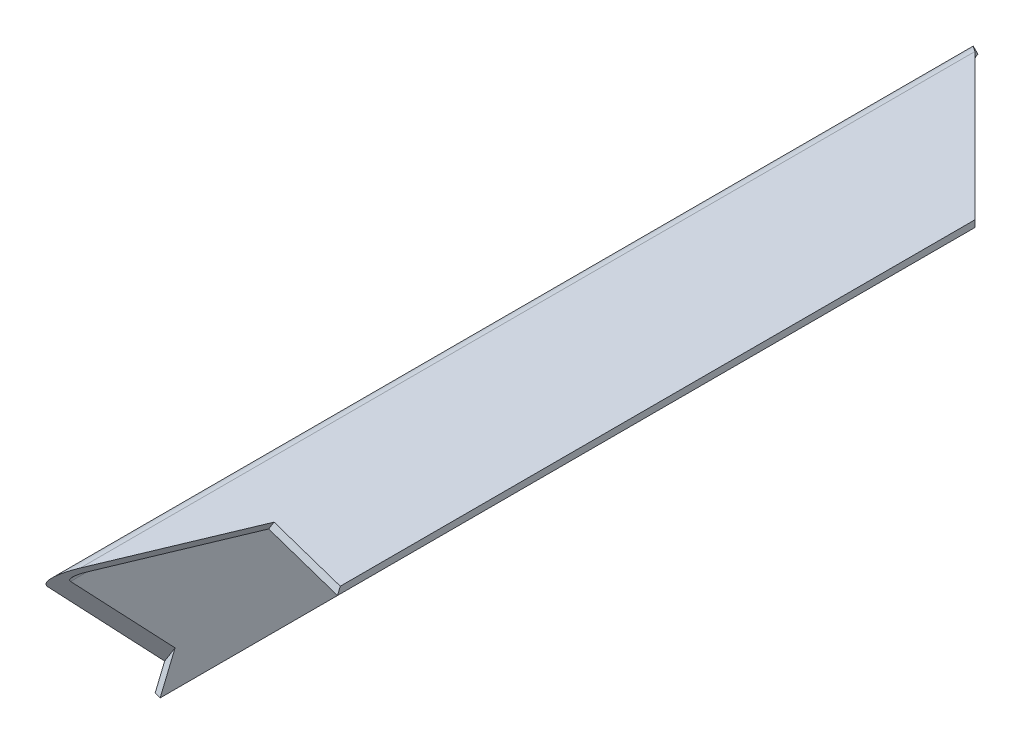
ISO-10303-21;
HEADER;
FILE_DESCRIPTION(('STEP AP214'),'2;1');
FILE_NAME('part.step','',(''),(''),'','','');
FILE_SCHEMA(('AUTOMOTIVE_DESIGN { 1 0 10303 214 1 1 1 1 }'));
ENDSEC;
DATA;
#1=APPLICATION_CONTEXT('core data for automotive mechanical design processes');
#2=APPLICATION_PROTOCOL_DEFINITION('international standard','automotive_design',2000,#1);
#3=PRODUCT_CONTEXT('',#1,'mechanical');
#4=PRODUCT('Part','Part','',(#3));
#5=PRODUCT_RELATED_PRODUCT_CATEGORY('part','',(#4));
#6=PRODUCT_DEFINITION_FORMATION('','',#4);
#7=PRODUCT_DEFINITION_CONTEXT('part definition',#1,'design');
#8=PRODUCT_DEFINITION('design','',#6,#7);
#9=PRODUCT_DEFINITION_SHAPE('','',#8);
#10=(LENGTH_UNIT() NAMED_UNIT(*) SI_UNIT(.MILLI.,.METRE.));
#11=(NAMED_UNIT(*) PLANE_ANGLE_UNIT() SI_UNIT($,.RADIAN.));
#12=(NAMED_UNIT(*) SI_UNIT($,.STERADIAN.) SOLID_ANGLE_UNIT());
#13=UNCERTAINTY_MEASURE_WITH_UNIT(LENGTH_MEASURE(1.E-05),#10,'distance_accuracy_value','');
#14=(GEOMETRIC_REPRESENTATION_CONTEXT(3) GLOBAL_UNCERTAINTY_ASSIGNED_CONTEXT((#13)) GLOBAL_UNIT_ASSIGNED_CONTEXT((#10,
#11,#12)) REPRESENTATION_CONTEXT('',''));
#15=CARTESIAN_POINT('',(0.,0.,0.));
#16=DIRECTION('',(0.,0.,1.));
#17=DIRECTION('',(1.,0.,0.));
#18=AXIS2_PLACEMENT_3D('',#15,#16,#17);
#19=CARTESIAN_POINT('',(-112.900713999999,0.188336430717542,0.));
#20=DIRECTION('',(-1.,0.,0.));
#21=DIRECTION('',(0.,0.,1.));
#22=AXIS2_PLACEMENT_3D('',#19,#20,#21);
#23=PLANE('',#22);
#24=DIRECTION('',(0.,-0.724219985563204,-0.68956900489424));
#25=VECTOR('',#24,1.);
#26=CARTESIAN_POINT('',(-112.900714,58.5682559872829,-61.3135222122132));
#27=LINE('',#26,#25);
#28=CARTESIAN_POINT('',(-112.900714,111.427514,-10.983364699464));
#29=VERTEX_POINT('',#28);
#30=CARTESIAN_POINT('',(-112.900714,97.9549512400546,-23.8113201286776));
#31=VERTEX_POINT('',#30);
#32=EDGE_CURVE('E114',#29,#31,#27,.T.);
#33=ORIENTED_EDGE('',*,*,#32,.F.);
#34=DIRECTION('',(0.,0.,-1.));
#35=VECTOR('',#34,1.);
#36=CARTESIAN_POINT('',(-112.900714,111.427514,0.));
#37=LINE('',#36,#35);
#38=CARTESIAN_POINT('',(-112.900714,111.427514,-111.239177569261));
#39=VERTEX_POINT('',#38);
#40=EDGE_CURVE('E54',#29,#39,#37,.T.);
#41=ORIENTED_EDGE('',*,*,#40,.T.);
#42=DIRECTION('',(0.,0.707106781186616,-0.70710678118648));
#43=VECTOR('',#42,1.);
#44=CARTESIAN_POINT('',(-112.900714,112.295300430737,-112.106963999998));
#45=LINE('',#44,#43);
#46=CARTESIAN_POINT('',(-112.900714,95.4360504307374,-95.2477140000015));
#47=VERTEX_POINT('',#46);
#48=EDGE_CURVE('E295',#47,#39,#45,.T.);
#49=ORIENTED_EDGE('',*,*,#48,.F.);
#50=DIRECTION('',(0.,0.,-1.));
#51=VECTOR('',#50,1.);
#52=CARTESIAN_POINT('',(-112.900714,95.4360504307374,95.2477140000016));
#53=LINE('',#52,#51);
#54=CARTESIAN_POINT('',(-112.900714,95.4360504307374,-22.762837404634));
#55=VERTEX_POINT('',#54);
#56=EDGE_CURVE('E131',#55,#47,#53,.T.);
#57=ORIENTED_EDGE('',*,*,#56,.F.);
#58=DIRECTION('',(0.,-0.923214701144146,0.384284550289659));
#59=VECTOR('',#58,1.);
#60=CARTESIAN_POINT('',(-112.900713999999,6.1782714866546,14.3903680186245));
#61=LINE('',#60,#59);
#62=EDGE_CURVE('E124',#31,#55,#61,.T.);
#63=ORIENTED_EDGE('',*,*,#62,.F.);
#64=EDGE_LOOP('',(#33,#41,#49,#57,#63));
#65=FACE_BOUND('',#64,.T.);
#66=ADVANCED_FACE('F32',(#65),#23,.T.);
#67=CARTESIAN_POINT('',(-112.164114,95.4360504307374,95.2477140000016));
#68=DIRECTION('',(0.,1.,0.));
#69=DIRECTION('',(0.,0.,1.));
#70=AXIS2_PLACEMENT_3D('',#67,#68,#69);
#71=PLANE('',#70);
#72=DIRECTION('',(0.,0.,-1.));
#73=VECTOR('',#72,1.);
#74=CARTESIAN_POINT('',(-112.164114,95.4360504307374,95.2477140000016));
#75=LINE('',#74,#73);
#76=CARTESIAN_POINT('',(-112.164114,95.4360504307374,-22.576656283523));
#77=VERTEX_POINT('',#76);
#78=CARTESIAN_POINT('',(-112.164114,95.4360504307374,-95.2477140000015));
#79=VERTEX_POINT('',#78);
#80=EDGE_CURVE('E297',#77,#79,#75,.T.);
#81=ORIENTED_EDGE('',*,*,#80,.F.);
#82=DIRECTION('',(-0.969510212842495,0.,-0.245050907352125));
#83=VECTOR('',#82,1.);
#84=CARTESIAN_POINT('',(-84.1714758285546,95.4360504307376,-15.5013090698193));
#85=LINE('',#84,#83);
#86=EDGE_CURVE('E133',#77,#55,#85,.T.);
#87=ORIENTED_EDGE('',*,*,#86,.T.);
#88=ORIENTED_EDGE('',*,*,#56,.T.);
#89=DIRECTION('',(-1.,0.,0.));
#90=VECTOR('',#89,1.);
#91=CARTESIAN_POINT('',(-112.164114,95.4360504307374,-95.2477140000015));
#92=LINE('',#91,#90);
#93=EDGE_CURVE('E311',#79,#47,#92,.T.);
#94=ORIENTED_EDGE('',*,*,#93,.F.);
#95=EDGE_LOOP('',(#81,#87,#88,#94));
#96=FACE_BOUND('',#95,.T.);
#97=ADVANCED_FACE('F343',(#96),#71,.F.);
#98=CARTESIAN_POINT('',(-112.164114,112.295300430737,-112.106963999998));
#99=DIRECTION('',(0.,0.70710678118648,0.707106781186616));
#100=DIRECTION('',(0.,-0.707106781186616,0.70710678118648));
#101=AXIS2_PLACEMENT_3D('',#98,#99,#100);
#102=PLANE('',#101);
#103=CARTESIAN_POINT('',(-112.164114,111.427514,-111.239177569261));
#104=CARTESIAN_POINT('',(-112.900714,111.427514,-111.239177569261));
#105=B_SPLINE_CURVE_WITH_KNOTS('',1,(#103,#104),.UNSPECIFIED.,.F.,.F.,(2,2),(0.,1.),.UNSPECIFIED.);
#106=CARTESIAN_POINT('',(-112.164114,111.427514,-111.239177569261));
#107=VERTEX_POINT('',#106);
#108=EDGE_CURVE('E255',#107,#39,#105,.T.);
#109=ORIENTED_EDGE('',*,*,#108,.F.);
#110=DIRECTION('',(0.,0.707106781186616,-0.70710678118648));
#111=VECTOR('',#110,1.);
#112=CARTESIAN_POINT('',(-112.164114,112.295300430737,-112.106963999998));
#113=LINE('',#112,#111);
#114=EDGE_CURVE('E304',#79,#107,#113,.T.);
#115=ORIENTED_EDGE('',*,*,#114,.F.);
#116=ORIENTED_EDGE('',*,*,#93,.T.);
#117=ORIENTED_EDGE('',*,*,#48,.T.);
#118=EDGE_LOOP('',(#109,#115,#116,#117));
#119=FACE_BOUND('',#118,.T.);
#120=ADVANCED_FACE('F302',(#119),#102,.F.);
#121=CARTESIAN_POINT('',(-112.164113999999,0.188336430717542,0.));
#122=DIRECTION('',(-1.,0.,0.));
#123=DIRECTION('',(0.,0.,1.));
#124=AXIS2_PLACEMENT_3D('',#121,#122,#123);
#125=PLANE('',#124);
#126=DIRECTION('',(0.,0.,-1.));
#127=VECTOR('',#126,1.);
#128=CARTESIAN_POINT('',(-112.164114,111.427514,0.));
#129=LINE('',#128,#127);
#130=CARTESIAN_POINT('',(-112.164114,111.427514,-12.7426126677546));
#131=VERTEX_POINT('',#130);
#132=EDGE_CURVE('E305',#131,#107,#129,.T.);
#133=ORIENTED_EDGE('',*,*,#132,.F.);
#134=DIRECTION('',(0.,-0.724219985563204,-0.68956900489424));
#135=VECTOR('',#134,1.);
#136=CARTESIAN_POINT('',(-112.164114,59.4468238153009,-62.2362382496329));
#137=LINE('',#136,#135);
#138=CARTESIAN_POINT('',(-112.164114,99.3766326219928,-24.2169083867113));
#139=VERTEX_POINT('',#138);
#140=EDGE_CURVE('E332',#131,#139,#137,.T.);
#141=ORIENTED_EDGE('',*,*,#140,.T.);
#142=DIRECTION('',(0.,-0.923214701144146,0.384284550289659));
#143=VECTOR('',#142,1.);
#144=CARTESIAN_POINT('',(-112.164113999999,6.24432429348798,14.549054914245));
#145=LINE('',#144,#143);
#146=EDGE_CURVE('E127',#139,#77,#145,.T.);
#147=ORIENTED_EDGE('',*,*,#146,.T.);
#148=ORIENTED_EDGE('',*,*,#80,.T.);
#149=ORIENTED_EDGE('',*,*,#114,.T.);
#150=EDGE_LOOP('',(#133,#141,#147,#148,#149));
#151=FACE_BOUND('',#150,.T.);
#152=ADVANCED_FACE('F308',(#151),#125,.F.);
#153=CARTESIAN_POINT('',(-95.436050430738,112.164114,95.2477140000016));
#154=DIRECTION('',(-1.,0.,0.));
#155=DIRECTION('',(0.,0.,-1.));
#156=AXIS2_PLACEMENT_3D('',#153,#154,#155);
#157=PLANE('',#156);
#158=DIRECTION('',(0.,0.,1.));
#159=VECTOR('',#158,1.);
#160=CARTESIAN_POINT('',(-95.436050430738,112.900714,95.2477140000016));
#161=LINE('',#160,#159);
#162=CARTESIAN_POINT('',(-95.436050430738,112.900714,-95.2477140000015));
#163=VERTEX_POINT('',#162);
#164=CARTESIAN_POINT('',(-95.436050430738,112.900714,-25.6181126623219));
#165=VERTEX_POINT('',#164);
#166=EDGE_CURVE('E273',#163,#165,#161,.T.);
#167=ORIENTED_EDGE('',*,*,#166,.T.);
#168=DIRECTION('',(0.,-0.923214701144146,0.384284550289658));
#169=VECTOR('',#168,1.);
#170=CARTESIAN_POINT('',(-95.4360504307379,69.3924580594404,-7.50796932590786));
#171=LINE('',#170,#169);
#172=CARTESIAN_POINT('',(-95.436050430738,112.164114,-25.3115057599485));
#173=VERTEX_POINT('',#172);
#174=EDGE_CURVE('E337',#165,#173,#171,.T.);
#175=ORIENTED_EDGE('',*,*,#174,.T.);
#176=DIRECTION('',(0.,0.,1.));
#177=VECTOR('',#176,1.);
#178=CARTESIAN_POINT('',(-95.436050430738,112.164114,95.2477140000016));
#179=LINE('',#178,#177);
#180=CARTESIAN_POINT('',(-95.436050430738,112.164114,-95.2477140000015));
#181=VERTEX_POINT('',#180);
#182=EDGE_CURVE('E259',#181,#173,#179,.T.);
#183=ORIENTED_EDGE('',*,*,#182,.F.);
#184=DIRECTION('',(0.,1.,0.));
#185=VECTOR('',#184,1.);
#186=CARTESIAN_POINT('',(-95.436050430738,112.164114,-95.2477140000015));
#187=LINE('',#186,#185);
#188=EDGE_CURVE('E269',#181,#163,#187,.T.);
#189=ORIENTED_EDGE('',*,*,#188,.T.);
#190=EDGE_LOOP('',(#167,#175,#183,#189));
#191=FACE_BOUND('',#190,.T.);
#192=ADVANCED_FACE('F217',(#191),#157,.F.);
#193=CARTESIAN_POINT('',(-224.402264430758,112.164113999999,0.));
#194=DIRECTION('',(0.,1.,0.));
#195=DIRECTION('',(0.,0.,1.));
#196=AXIS2_PLACEMENT_3D('',#193,#194,#195);
#197=PLANE('',#196);
#198=DIRECTION('',(-0.969510212842495,0.,-0.245050907352127));
#199=VECTOR('',#198,1.);
#200=CARTESIAN_POINT('',(-210.644358818371,112.164113999999,-54.4312614169006));
#201=LINE('',#200,#199);
#202=CARTESIAN_POINT('',(-105.538678158533,112.164114,-27.865019955615));
#203=VERTEX_POINT('',#202);
#204=EDGE_CURVE('E340',#173,#203,#201,.T.);
#205=ORIENTED_EDGE('',*,*,#204,.T.);
#206=DIRECTION('',(-0.386214206739789,0.,0.922409121004533));
#207=VECTOR('',#206,1.);
#208=CARTESIAN_POINT('',(-133.19538258964,112.164114,38.1884705141635));
#209=LINE('',#208,#207);
#210=CARTESIAN_POINT('',(-111.427514,112.164114,-13.8005039500514));
#211=VERTEX_POINT('',#210);
#212=EDGE_CURVE('E330',#203,#211,#209,.T.);
#213=ORIENTED_EDGE('',*,*,#212,.T.);
#214=DIRECTION('',(0.,0.,-1.));
#215=VECTOR('',#214,1.);
#216=CARTESIAN_POINT('',(-111.427514,112.164114,0.));
#217=LINE('',#216,#215);
#218=CARTESIAN_POINT('',(-111.427514,112.164114,-111.239177569261));
#219=VERTEX_POINT('',#218);
#220=EDGE_CURVE('E272',#211,#219,#217,.T.);
#221=ORIENTED_EDGE('',*,*,#220,.T.);
#222=DIRECTION('',(0.707106781186614,0.,0.707106781186481));
#223=VECTOR('',#222,1.);
#224=CARTESIAN_POINT('',(-112.295300430738,112.164114,-112.106963999998));
#225=LINE('',#224,#223);
#226=EDGE_CURVE('E268',#219,#181,#225,.T.);
#227=ORIENTED_EDGE('',*,*,#226,.T.);
#228=ORIENTED_EDGE('',*,*,#182,.T.);
#229=EDGE_LOOP('',(#205,#213,#221,#227,#228));
#230=FACE_BOUND('',#229,.T.);
#231=ADVANCED_FACE('F357',(#230),#197,.F.);
#232=CARTESIAN_POINT('',(-112.295300430738,112.164114,-112.106963999998));
#233=DIRECTION('',(-0.707106781186481,0.,0.707106781186614));
#234=DIRECTION('',(-0.707106781186614,0.,-0.707106781186481));
#235=AXIS2_PLACEMENT_3D('',#232,#233,#234);
#236=PLANE('',#235);
#237=ORIENTED_EDGE('',*,*,#226,.F.);
#238=CARTESIAN_POINT('',(-111.427514,112.900714,-111.239177569261));
#239=CARTESIAN_POINT('',(-111.427514,112.164114,-111.239177569261));
#240=B_SPLINE_CURVE_WITH_KNOTS('',1,(#238,#239),.UNSPECIFIED.,.F.,.F.,(2,2),(0.,1.),.UNSPECIFIED.);
#241=CARTESIAN_POINT('',(-111.427514,112.900714,-111.239177569261));
#242=VERTEX_POINT('',#241);
#243=EDGE_CURVE('E267',#219,#242,#240,.F.);
#244=ORIENTED_EDGE('',*,*,#243,.T.);
#245=DIRECTION('',(0.707106781186614,0.,0.707106781186481));
#246=VECTOR('',#245,1.);
#247=CARTESIAN_POINT('',(-112.295300430738,112.900714,-112.106963999998));
#248=LINE('',#247,#246);
#249=EDGE_CURVE('E279',#242,#163,#248,.T.);
#250=ORIENTED_EDGE('',*,*,#249,.T.);
#251=ORIENTED_EDGE('',*,*,#188,.F.);
#252=EDGE_LOOP('',(#237,#244,#250,#251));
#253=FACE_BOUND('',#252,.T.);
#254=ADVANCED_FACE('F362',(#253),#236,.F.);
#255=CARTESIAN_POINT('',(-224.402264430758,112.900713999999,0.));
#256=DIRECTION('',(0.,1.,0.));
#257=DIRECTION('',(0.,0.,1.));
#258=AXIS2_PLACEMENT_3D('',#255,#256,#257);
#259=PLANE('',#258);
#260=DIRECTION('',(-0.386214206739789,0.,0.922409121004533));
#261=VECTOR('',#260,1.);
#262=CARTESIAN_POINT('',(-132.945526018766,112.900714,38.2930858688053));
#263=LINE('',#262,#261);
#264=CARTESIAN_POINT('',(-105.15703177356,112.900714,-28.0751628995004));
#265=VERTEX_POINT('',#264);
#266=CARTESIAN_POINT('',(-111.427514,112.900714,-13.0991472640576));
#267=VERTEX_POINT('',#266);
#268=EDGE_CURVE('E46',#265,#267,#263,.T.);
#269=ORIENTED_EDGE('',*,*,#268,.F.);
#270=DIRECTION('',(-0.969510212842495,0.,-0.245050907352127));
#271=VECTOR('',#270,1.);
#272=CARTESIAN_POINT('',(-210.571515347548,112.900713999999,-54.7194565909771));
#273=LINE('',#272,#271);
#274=EDGE_CURVE('E11',#165,#265,#273,.T.);
#275=ORIENTED_EDGE('',*,*,#274,.F.);
#276=ORIENTED_EDGE('',*,*,#166,.F.);
#277=ORIENTED_EDGE('',*,*,#249,.F.);
#278=DIRECTION('',(0.,0.,-1.));
#279=VECTOR('',#278,1.);
#280=CARTESIAN_POINT('',(-111.427514,112.900714,0.));
#281=LINE('',#280,#279);
#282=EDGE_CURVE('E276',#267,#242,#281,.T.);
#283=ORIENTED_EDGE('',*,*,#282,.F.);
#284=EDGE_LOOP('',(#269,#275,#276,#277,#283));
#285=FACE_BOUND('',#284,.T.);
#286=ADVANCED_FACE('F213',(#285),#259,.T.);
#287=CARTESIAN_POINT('',(-112.900714,111.427514,-111.239177569261));
#288=CARTESIAN_POINT('',(-112.900714,111.620377681075,-111.383825330067));
#289=CARTESIAN_POINT('',(-112.862370547268,111.813120983238,-111.52843971284));
#290=CARTESIAN_POINT('',(-112.714776107324,112.169445481882,-111.817701856419));
#291=CARTESIAN_POINT('',(-112.605598926777,112.332848493311,-111.962316239192));
#292=CARTESIAN_POINT('',(-112.469223710044,112.469223710044,-112.106963999998));
#293=CARTESIAN_POINT('',(-112.164114,111.427514,-111.239177569261));
#294=CARTESIAN_POINT('',(-112.164114,111.52394006357,-111.383816664616));
#295=CARTESIAN_POINT('',(-112.144942273634,111.620317491619,-111.52843971284));
#296=CARTESIAN_POINT('',(-112.071145053662,111.798479740941,-111.817701856419));
#297=CARTESIAN_POINT('',(-112.016552378456,111.880185331588,-111.962324904643));
#298=CARTESIAN_POINT('',(-111.948368855022,111.948368855022,-112.106963999998));
#299=B_SPLINE_SURFACE_WITH_KNOTS('',1,3,((#287,#288,#289,#290,#291,#292),(#293,#294,#295,#296,
#297,#298)),.UNSPECIFIED.,.F.,.F.,.F.,(2,2),(4,2,4),(0.,1.),(0.,0.5,1.),.UNSPECIFIED.);
#300=CARTESIAN_POINT('',(-112.900714,111.427514,-111.239177569261));
#301=CARTESIAN_POINT('',(-112.900714,111.620377681075,-111.383825330067));
#302=CARTESIAN_POINT('',(-112.862370547268,111.813120983238,-111.52843971284));
#303=CARTESIAN_POINT('',(-112.714776107324,112.169445481882,-111.817701856419));
#304=CARTESIAN_POINT('',(-112.605598926777,112.332848493311,-111.962316239192));
#305=CARTESIAN_POINT('',(-112.469223710044,112.469223710044,-112.106963999998));
#306=B_SPLINE_CURVE_WITH_KNOTS('',3,(#300,#301,#302,#303,#304,#305),.UNSPECIFIED.,.F.,.F.,(4,2,
4),(0.,0.5,1.),.UNSPECIFIED.);
#307=CARTESIAN_POINT('',(-112.469223945747,112.469223474341,-112.106963749998));
#308=VERTEX_POINT('',#307);
#309=EDGE_CURVE('E132',#39,#308,#306,.T.);
#310=CARTESIAN_POINT('',(-112.469223710044,112.469223710044,-112.106963999998));
#311=CARTESIAN_POINT('',(-111.948368855022,111.948368855022,-112.106963999998));
#312=B_SPLINE_CURVE_WITH_KNOTS('',1,(#310,#311),.UNSPECIFIED.,.F.,.F.,(2,2),(0.,1.),.UNSPECIFIED.);
#313=CARTESIAN_POINT('',(-111.948368855022,111.948368855022,-112.106963999998));
#314=VERTEX_POINT('',#313);
#315=EDGE_CURVE('E245',#308,#314,#312,.T.);
#316=CARTESIAN_POINT('',(-111.948368855022,111.948368855022,-112.106963999998));
#317=CARTESIAN_POINT('',(-112.016552378456,111.880185331588,-111.962324904643));
#318=CARTESIAN_POINT('',(-112.071145053662,111.798479740941,-111.817701856419));
#319=CARTESIAN_POINT('',(-112.144942273634,111.620317491619,-111.52843971284));
#320=CARTESIAN_POINT('',(-112.164114,111.52394006357,-111.383816664616));
#321=CARTESIAN_POINT('',(-112.164114,111.427514,-111.239177569261));
#322=B_SPLINE_CURVE_WITH_KNOTS('',3,(#316,#317,#318,#319,#320,#321),.UNSPECIFIED.,.F.,.F.,(4,2,
4),(0.,0.5,1.),.UNSPECIFIED.);
#323=EDGE_CURVE('E178',#107,#314,#322,.F.);
#324=ORIENTED_EDGE('',*,*,#108,.T.);
#325=ORIENTED_EDGE('',*,*,#309,.T.);
#326=ORIENTED_EDGE('',*,*,#315,.T.);
#327=ORIENTED_EDGE('',*,*,#323,.F.);
#328=EDGE_LOOP('',(#324,#325,#326,#327));
#329=FACE_BOUND('',#328,.T.);
#330=ADVANCED_FACE('F202',(#329),#299,.F.);
#331=CARTESIAN_POINT('',(-112.469223710044,112.469223710044,-112.106963999998));
#332=CARTESIAN_POINT('',(-112.332848493311,112.605598926776,-111.962316239192));
#333=CARTESIAN_POINT('',(-112.169445481883,112.714776107323,-111.817701856419));
#334=CARTESIAN_POINT('',(-111.813120983238,112.862370547267,-111.52843971284));
#335=CARTESIAN_POINT('',(-111.620377681075,112.900714,-111.383825330067));
#336=CARTESIAN_POINT('',(-111.427514,112.900714,-111.239177569261));
#337=CARTESIAN_POINT('',(-111.948368855022,111.948368855022,-112.106963999998));
#338=CARTESIAN_POINT('',(-111.880185331589,112.016552378455,-111.962324904643));
#339=CARTESIAN_POINT('',(-111.798479740941,112.071145053661,-111.817701856419));
#340=CARTESIAN_POINT('',(-111.620317491619,112.144942273634,-111.52843971284));
#341=CARTESIAN_POINT('',(-111.52394006357,112.164114,-111.383816664616));
#342=CARTESIAN_POINT('',(-111.427514,112.164114,-111.239177569261));
#343=B_SPLINE_SURFACE_WITH_KNOTS('',1,3,((#331,#332,#333,#334,#335,#336),(#337,#338,#339,#340,
#341,#342)),.UNSPECIFIED.,.F.,.F.,.F.,(2,2),(4,2,4),(0.,1.),(0.,0.5,1.),.UNSPECIFIED.);
#344=CARTESIAN_POINT('',(-112.469223710044,112.469223710044,-112.106963999998));
#345=CARTESIAN_POINT('',(-112.332848493311,112.605598926776,-111.962316239192));
#346=CARTESIAN_POINT('',(-112.169445481883,112.714776107323,-111.817701856419));
#347=CARTESIAN_POINT('',(-111.813120983238,112.862370547267,-111.52843971284));
#348=CARTESIAN_POINT('',(-111.620377681075,112.900714,-111.383825330067));
#349=CARTESIAN_POINT('',(-111.427514,112.900714,-111.239177569261));
#350=B_SPLINE_CURVE_WITH_KNOTS('',3,(#344,#345,#346,#347,#348,#349),.UNSPECIFIED.,.F.,.F.,(4,2,
4),(0.,0.5,1.),.UNSPECIFIED.);
#351=EDGE_CURVE('E136',#308,#242,#350,.T.);
#352=CARTESIAN_POINT('',(-111.427514,112.164114,-111.239177569261));
#353=CARTESIAN_POINT('',(-111.52394006357,112.164114,-111.383816664616));
#354=CARTESIAN_POINT('',(-111.620317491619,112.144942273634,-111.52843971284));
#355=CARTESIAN_POINT('',(-111.798479740941,112.071145053661,-111.817701856419));
#356=CARTESIAN_POINT('',(-111.880185331589,112.016552378455,-111.962324904643));
#357=CARTESIAN_POINT('',(-111.948368855022,111.948368855022,-112.106963999998));
#358=B_SPLINE_CURVE_WITH_KNOTS('',3,(#352,#353,#354,#355,#356,#357),.UNSPECIFIED.,.F.,.F.,(4,2,
4),(0.,0.5,1.),.UNSPECIFIED.);
#359=EDGE_CURVE('E379',#314,#219,#358,.F.);
#360=ORIENTED_EDGE('',*,*,#315,.F.);
#361=ORIENTED_EDGE('',*,*,#351,.T.);
#362=ORIENTED_EDGE('',*,*,#243,.F.);
#363=ORIENTED_EDGE('',*,*,#359,.F.);
#364=EDGE_LOOP('',(#360,#361,#362,#363));
#365=FACE_BOUND('',#364,.T.);
#366=ADVANCED_FACE('F157',(#365),#343,.F.);
#367=CARTESIAN_POINT('',(-111.427514,111.427514,224.221855094246));
#368=DIRECTION('',(0.,0.,-1.));
#369=DIRECTION('',(1.,0.,0.));
#370=AXIS2_PLACEMENT_3D('',#367,#368,#369);
#371=CYLINDRICAL_SURFACE('',#370,0.7366);
#372=CARTESIAN_POINT('',(-111.427514,111.427514,-14.5018606360452));
#373=DIRECTION('',(-0.865728638508029,0.345138706889568,-0.362481996068263));
#374=DIRECTION('',(0.336710462965478,-0.134235843213375,-0.93199077384187));
#375=AXIS2_PLACEMENT_3D('',#372,#373,#374);
#376=ELLIPSE('',#375,2.03210092636237,0.7366);
#377=EDGE_CURVE('E120',#131,#211,#376,.T.);
#378=ORIENTED_EDGE('',*,*,#377,.F.);
#379=ORIENTED_EDGE('',*,*,#132,.T.);
#380=ORIENTED_EDGE('',*,*,#323,.T.);
#381=ORIENTED_EDGE('',*,*,#359,.T.);
#382=ORIENTED_EDGE('',*,*,#220,.F.);
#383=EDGE_LOOP('',(#378,#379,#380,#381,#382));
#384=FACE_BOUND('',#383,.T.);
#385=ADVANCED_FACE('F146',(#384),#371,.F.);
#386=CARTESIAN_POINT('',(-111.427514,111.427514,224.221855094246));
#387=DIRECTION('',(0.,0.,-1.));
#388=DIRECTION('',(1.,0.,0.));
#389=AXIS2_PLACEMENT_3D('',#386,#387,#388);
#390=CYLINDRICAL_SURFACE('',#389,1.4732);
#391=ORIENTED_EDGE('',*,*,#40,.F.);
#392=CARTESIAN_POINT('',(-111.427514,111.427514,-14.5018606360452));
#393=DIRECTION('',(-0.865728638508029,0.345138706889568,-0.362481996068263));
#394=DIRECTION('',(0.336710462965478,-0.134235843213375,-0.93199077384187));
#395=AXIS2_PLACEMENT_3D('',#392,#393,#394);
#396=ELLIPSE('',#395,4.06420185272475,1.4732);
#397=EDGE_CURVE('E39',#29,#267,#396,.T.);
#398=ORIENTED_EDGE('',*,*,#397,.T.);
#399=ORIENTED_EDGE('',*,*,#282,.T.);
#400=ORIENTED_EDGE('',*,*,#351,.F.);
#401=ORIENTED_EDGE('',*,*,#309,.F.);
#402=EDGE_LOOP('',(#391,#398,#399,#400,#401));
#403=FACE_BOUND('',#402,.T.);
#404=ADVANCED_FACE('F156',(#403),#390,.T.);
#405=CARTESIAN_POINT('',(8.30044554866637,-51.1988767971413,68.9078774769948));
#406=DIRECTION('',(0.22724442901572,-0.374230803028497,-0.899061330247256));
#407=DIRECTION('',(0.,0.923214701144146,-0.384284550289657));
#408=AXIS2_PLACEMENT_3D('',#405,#406,#407);
#409=PLANE('',#408);
#410=ORIENTED_EDGE('',*,*,#174,.F.);
#411=ORIENTED_EDGE('',*,*,#274,.T.);
#412=DIRECTION('',(0.445952793407951,0.860715155595185,-0.245551475215283));
#413=VECTOR('',#412,1.);
#414=CARTESIAN_POINT('',(-156.201080390501,14.3826939382925,0.0308196711362452));
#415=LINE('',#414,#413);
#416=EDGE_CURVE('E128',#203,#265,#415,.T.);
#417=ORIENTED_EDGE('',*,*,#416,.F.);
#418=ORIENTED_EDGE('',*,*,#204,.F.);
#419=EDGE_LOOP('',(#410,#411,#417,#418));
#420=FACE_BOUND('',#419,.T.);
#421=ADVANCED_FACE('F374',(#420),#409,.F.);
#422=CARTESIAN_POINT('',(-156.201080390501,14.3826939382925,0.0308196711362452));
#423=DIRECTION('',(-0.865728638508029,0.345138706889568,-0.362481996068263));
#424=DIRECTION('',(-0.386214206739789,0.,0.922409121004533));
#425=AXIS2_PLACEMENT_3D('',#422,#423,#424);
#426=PLANE('',#425);
#427=ORIENTED_EDGE('',*,*,#377,.T.);
#428=ORIENTED_EDGE('',*,*,#212,.F.);
#429=ORIENTED_EDGE('',*,*,#416,.T.);
#430=ORIENTED_EDGE('',*,*,#268,.T.);
#431=ORIENTED_EDGE('',*,*,#397,.F.);
#432=ORIENTED_EDGE('',*,*,#32,.T.);
#433=EDGE_CURVE('E117',#31,#139,#415,.T.);
#434=ORIENTED_EDGE('',*,*,#433,.T.);
#435=ORIENTED_EDGE('',*,*,#140,.F.);
#436=EDGE_LOOP('',(#427,#428,#429,#430,#431,#432,#434,#435));
#437=FACE_BOUND('',#436,.T.);
#438=ADVANCED_FACE('F116',(#437),#426,.F.);
#439=ORIENTED_EDGE('',*,*,#62,.T.);
#440=ORIENTED_EDGE('',*,*,#86,.F.);
#441=ORIENTED_EDGE('',*,*,#146,.F.);
#442=ORIENTED_EDGE('',*,*,#433,.F.);
#443=EDGE_LOOP('',(#439,#440,#441,#442));
#444=FACE_BOUND('',#443,.T.);
#445=ADVANCED_FACE('F123',(#444),#409,.F.);
#446=CLOSED_SHELL('',(#66,#97,#120,#152,#192,#231,#254,#286,#330,#366,#385,#404,#421,#438,#445));
#447=MANIFOLD_SOLID_BREP('B2',#446);
#448=ADVANCED_BREP_SHAPE_REPRESENTATION('',(#18,#447),#14);
#449=SHAPE_DEFINITION_REPRESENTATION(#9,#448);
ENDSEC;
END-ISO-10303-21;
